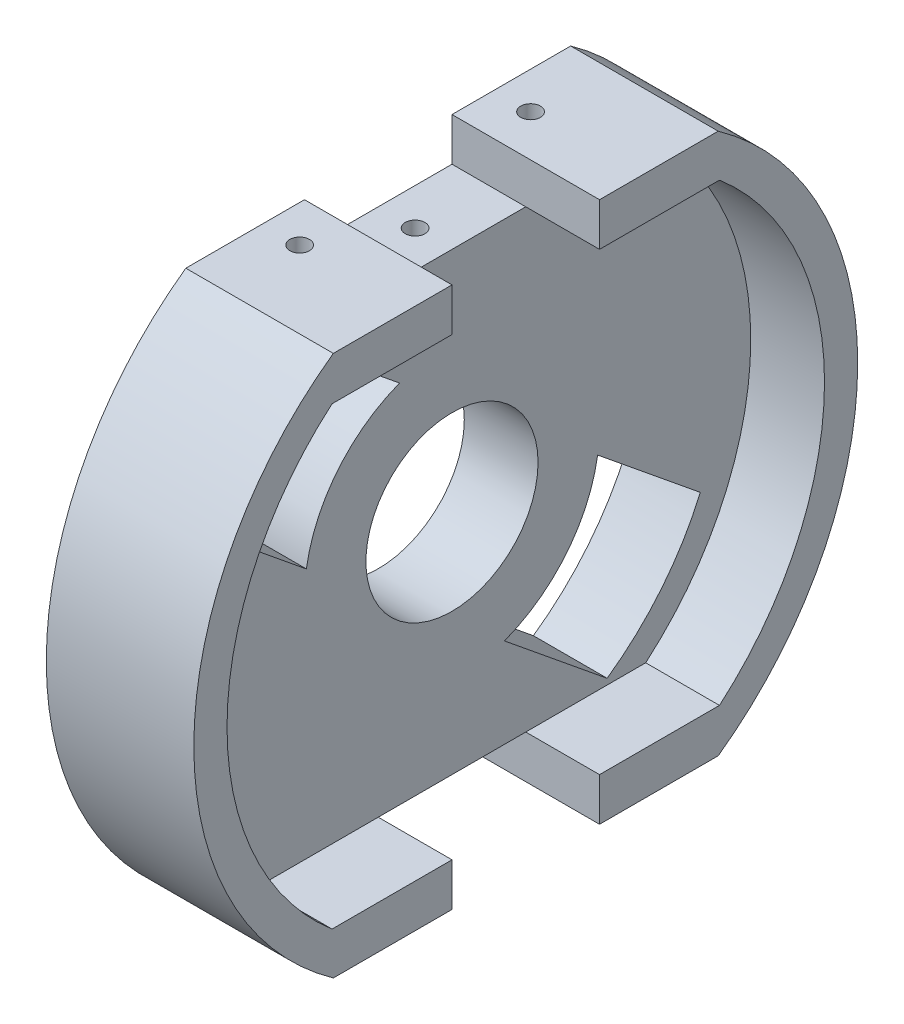
ISO-10303-21;
HEADER;
FILE_DESCRIPTION(('STEP AP214'),'2;1');
FILE_NAME('part.step','',(''),(''),'','','');
FILE_SCHEMA(('AUTOMOTIVE_DESIGN { 1 0 10303 214 1 1 1 1 }'));
ENDSEC;
DATA;
#1=APPLICATION_CONTEXT('core data for automotive mechanical design processes');
#2=APPLICATION_PROTOCOL_DEFINITION('international standard','automotive_design',2000,#1);
#3=PRODUCT_CONTEXT('',#1,'mechanical');
#4=PRODUCT('Part','Part','',(#3));
#5=PRODUCT_RELATED_PRODUCT_CATEGORY('part','',(#4));
#6=PRODUCT_DEFINITION_FORMATION('','',#4);
#7=PRODUCT_DEFINITION_CONTEXT('part definition',#1,'design');
#8=PRODUCT_DEFINITION('design','',#6,#7);
#9=PRODUCT_DEFINITION_SHAPE('','',#8);
#10=(LENGTH_UNIT() NAMED_UNIT(*) SI_UNIT(.MILLI.,.METRE.));
#11=(NAMED_UNIT(*) PLANE_ANGLE_UNIT() SI_UNIT($,.RADIAN.));
#12=(NAMED_UNIT(*) SI_UNIT($,.STERADIAN.) SOLID_ANGLE_UNIT());
#13=UNCERTAINTY_MEASURE_WITH_UNIT(LENGTH_MEASURE(1.E-05),#10,'distance_accuracy_value','');
#14=(GEOMETRIC_REPRESENTATION_CONTEXT(3) GLOBAL_UNCERTAINTY_ASSIGNED_CONTEXT((#13)) GLOBAL_UNIT_ASSIGNED_CONTEXT((#10,
#11,#12)) REPRESENTATION_CONTEXT('',''));
#15=CARTESIAN_POINT('',(0.,0.,0.));
#16=DIRECTION('',(0.,0.,1.));
#17=DIRECTION('',(1.,0.,0.));
#18=AXIS2_PLACEMENT_3D('',#15,#16,#17);
#19=CARTESIAN_POINT('',(3.,-11.,0.));
#20=DIRECTION('',(0.,1.,0.));
#21=DIRECTION('',(0.,0.,1.));
#22=AXIS2_PLACEMENT_3D('',#19,#20,#21);
#23=PLANE('',#22);
#24=DIRECTION('',(0.,0.,-1.));
#25=VECTOR('',#24,1.);
#26=CARTESIAN_POINT('',(6.,-11.,0.));
#27=LINE('',#26,#25);
#28=CARTESIAN_POINT('',(6.,-11.,-3.));
#29=VERTEX_POINT('',#28);
#30=CARTESIAN_POINT('',(6.,-11.,-7.82623792124926));
#31=VERTEX_POINT('',#30);
#32=EDGE_CURVE('E306',#29,#31,#27,.T.);
#33=ORIENTED_EDGE('',*,*,#32,.F.);
#34=DIRECTION('',(1.,0.,0.));
#35=VECTOR('',#34,1.);
#36=CARTESIAN_POINT('',(6.,-11.,-3.));
#37=LINE('',#36,#35);
#38=CARTESIAN_POINT('',(0.,-11.,-3.));
#39=VERTEX_POINT('',#38);
#40=EDGE_CURVE('E247',#39,#29,#37,.T.);
#41=ORIENTED_EDGE('',*,*,#40,.F.);
#42=DIRECTION('',(0.,0.,-1.));
#43=VECTOR('',#42,1.);
#44=CARTESIAN_POINT('',(0.,-11.,0.));
#45=LINE('',#44,#43);
#46=CARTESIAN_POINT('',(0.,-11.,-7.82623792124926));
#47=VERTEX_POINT('',#46);
#48=EDGE_CURVE('E387',#39,#47,#45,.T.);
#49=ORIENTED_EDGE('',*,*,#48,.T.);
#50=DIRECTION('',(-1.,0.,0.));
#51=VECTOR('',#50,1.);
#52=CARTESIAN_POINT('',(3.,-11.,-7.82623792124926));
#53=LINE('',#52,#51);
#54=EDGE_CURVE('E404',#31,#47,#53,.T.);
#55=ORIENTED_EDGE('',*,*,#54,.F.);
#56=EDGE_LOOP('',(#33,#41,#49,#55));
#57=FACE_BOUND('',#56,.T.);
#58=ADVANCED_FACE('F41',(#57),#23,.F.);
#59=CARTESIAN_POINT('',(6.,-9.25,0.));
#60=DIRECTION('',(0.,1.,0.));
#61=DIRECTION('',(0.,0.,1.));
#62=AXIS2_PLACEMENT_3D('',#59,#60,#61);
#63=PLANE('',#62);
#64=DIRECTION('',(-1.,0.,0.));
#65=VECTOR('',#64,1.);
#66=CARTESIAN_POINT('',(6.,-9.25,-3.));
#67=LINE('',#66,#65);
#68=CARTESIAN_POINT('',(6.,-9.25,-3.));
#69=VERTEX_POINT('',#68);
#70=CARTESIAN_POINT('',(3.,-9.25,-3.));
#71=VERTEX_POINT('',#70);
#72=EDGE_CURVE('E226',#69,#71,#67,.T.);
#73=ORIENTED_EDGE('',*,*,#72,.F.);
#74=DIRECTION('',(0.,0.,-1.));
#75=VECTOR('',#74,1.);
#76=CARTESIAN_POINT('',(6.,-9.25,0.));
#77=LINE('',#76,#75);
#78=CARTESIAN_POINT('',(6.,-9.25,-7.87781695649246));
#79=VERTEX_POINT('',#78);
#80=EDGE_CURVE('E294',#69,#79,#77,.T.);
#81=ORIENTED_EDGE('',*,*,#80,.T.);
#82=DIRECTION('',(-1.,0.,0.));
#83=VECTOR('',#82,1.);
#84=CARTESIAN_POINT('',(6.,-9.25,-7.87781695649246));
#85=LINE('',#84,#83);
#86=CARTESIAN_POINT('',(3.,-9.25,-7.87781695649246));
#87=VERTEX_POINT('',#86);
#88=EDGE_CURVE('E339',#79,#87,#85,.T.);
#89=ORIENTED_EDGE('',*,*,#88,.T.);
#90=DIRECTION('',(0.,0.,-1.));
#91=VECTOR('',#90,1.);
#92=CARTESIAN_POINT('',(3.,-9.25,0.));
#93=LINE('',#92,#91);
#94=EDGE_CURVE('E323',#71,#87,#93,.T.);
#95=ORIENTED_EDGE('',*,*,#94,.F.);
#96=EDGE_LOOP('',(#73,#81,#89,#95));
#97=FACE_BOUND('',#96,.T.);
#98=ADVANCED_FACE('F449',(#97),#63,.T.);
#99=CARTESIAN_POINT('',(6.,0.,0.));
#100=DIRECTION('',(1.,0.,0.));
#101=DIRECTION('',(0.,0.,-1.));
#102=AXIS2_PLACEMENT_3D('',#99,#100,#101);
#103=PLANE('',#102);
#104=DIRECTION('',(0.,1.,0.));
#105=VECTOR('',#104,1.);
#106=CARTESIAN_POINT('',(6.,-19.4852813742386,-3.));
#107=LINE('',#106,#105);
#108=EDGE_CURVE('E253',#29,#69,#107,.T.);
#109=ORIENTED_EDGE('',*,*,#108,.F.);
#110=ORIENTED_EDGE('',*,*,#32,.T.);
#111=CARTESIAN_POINT('',(6.,0.,0.));
#112=DIRECTION('',(1.,0.,0.));
#113=DIRECTION('',(0.,0.,-1.));
#114=AXIS2_PLACEMENT_3D('',#111,#112,#113);
#115=CIRCLE('',#114,13.5);
#116=CARTESIAN_POINT('',(6.,11.,-7.82623792124927));
#117=VERTEX_POINT('',#116);
#118=EDGE_CURVE('E310',#31,#117,#115,.T.);
#119=ORIENTED_EDGE('',*,*,#118,.T.);
#120=DIRECTION('',(0.,0.,1.));
#121=VECTOR('',#120,1.);
#122=CARTESIAN_POINT('',(6.,11.,0.));
#123=LINE('',#122,#121);
#124=CARTESIAN_POINT('',(6.,11.,-3.));
#125=VERTEX_POINT('',#124);
#126=EDGE_CURVE('E314',#117,#125,#123,.T.);
#127=ORIENTED_EDGE('',*,*,#126,.T.);
#128=DIRECTION('',(0.,1.,0.));
#129=VECTOR('',#128,1.);
#130=CARTESIAN_POINT('',(6.,0.764718625761432,-3.));
#131=LINE('',#130,#129);
#132=CARTESIAN_POINT('',(6.,9.25,-3.));
#133=VERTEX_POINT('',#132);
#134=EDGE_CURVE('E279',#133,#125,#131,.T.);
#135=ORIENTED_EDGE('',*,*,#134,.F.);
#136=DIRECTION('',(0.,0.,-1.));
#137=VECTOR('',#136,1.);
#138=CARTESIAN_POINT('',(6.,9.25,0.));
#139=LINE('',#138,#137);
#140=CARTESIAN_POINT('',(6.,9.25,-7.87781695649245));
#141=VERTEX_POINT('',#140);
#142=EDGE_CURVE('E302',#133,#141,#139,.T.);
#143=ORIENTED_EDGE('',*,*,#142,.T.);
#144=CARTESIAN_POINT('',(6.,0.,0.));
#145=DIRECTION('',(1.,0.,0.));
#146=DIRECTION('',(0.,0.,-1.));
#147=AXIS2_PLACEMENT_3D('',#144,#145,#146);
#148=CIRCLE('',#147,12.15);
#149=EDGE_CURVE('E291',#79,#141,#148,.T.);
#150=ORIENTED_EDGE('',*,*,#149,.F.);
#151=ORIENTED_EDGE('',*,*,#80,.F.);
#152=EDGE_LOOP('',(#109,#110,#119,#127,#135,#143,#150,#151));
#153=FACE_BOUND('',#152,.T.);
#154=ADVANCED_FACE('F455',(#153),#103,.T.);
#155=CARTESIAN_POINT('',(3.,11.,0.));
#156=DIRECTION('',(0.,1.,0.));
#157=DIRECTION('',(0.,0.,1.));
#158=AXIS2_PLACEMENT_3D('',#155,#156,#157);
#159=PLANE('',#158);
#160=CARTESIAN_POINT('',(1.5,11.,-4.69574275274956));
#161=DIRECTION('',(0.,1.,0.));
#162=DIRECTION('',(0.,0.,1.));
#163=AXIS2_PLACEMENT_3D('',#160,#161,#162);
#164=CIRCLE('',#163,0.4);
#165=CARTESIAN_POINT('',(1.5,11.,-4.29574275274956));
#166=VERTEX_POINT('',#165);
#167=EDGE_CURVE('E1074',#166,#166,#164,.T.);
#168=ORIENTED_EDGE('',*,*,#167,.F.);
#169=EDGE_LOOP('',(#168));
#170=FACE_BOUND('',#169,.T.);
#171=DIRECTION('',(-1.,0.,0.));
#172=VECTOR('',#171,1.);
#173=CARTESIAN_POINT('',(0.,11.,-3.));
#174=LINE('',#173,#172);
#175=CARTESIAN_POINT('',(0.,11.,-3.));
#176=VERTEX_POINT('',#175);
#177=EDGE_CURVE('E273',#125,#176,#174,.T.);
#178=ORIENTED_EDGE('',*,*,#177,.F.);
#179=ORIENTED_EDGE('',*,*,#126,.F.);
#180=DIRECTION('',(-1.,0.,0.));
#181=VECTOR('',#180,1.);
#182=CARTESIAN_POINT('',(3.,11.,-7.82623792124927));
#183=LINE('',#182,#181);
#184=CARTESIAN_POINT('',(0.,11.,-7.82623792124927));
#185=VERTEX_POINT('',#184);
#186=EDGE_CURVE('E401',#117,#185,#183,.T.);
#187=ORIENTED_EDGE('',*,*,#186,.T.);
#188=DIRECTION('',(0.,0.,-1.));
#189=VECTOR('',#188,1.);
#190=CARTESIAN_POINT('',(0.,11.,0.));
#191=LINE('',#190,#189);
#192=EDGE_CURVE('E381',#176,#185,#191,.T.);
#193=ORIENTED_EDGE('',*,*,#192,.F.);
#194=EDGE_LOOP('',(#178,#179,#187,#193));
#195=FACE_BOUND('',#194,.T.);
#196=ADVANCED_FACE('F511',(#170,#195),#159,.T.);
#197=CARTESIAN_POINT('',(6.,9.25,0.));
#198=DIRECTION('',(0.,1.,0.));
#199=DIRECTION('',(0.,0.,1.));
#200=AXIS2_PLACEMENT_3D('',#197,#198,#199);
#201=PLANE('',#200);
#202=ORIENTED_EDGE('',*,*,#142,.F.);
#203=DIRECTION('',(1.,0.,0.));
#204=VECTOR('',#203,1.);
#205=CARTESIAN_POINT('',(0.,9.25,-3.));
#206=LINE('',#205,#204);
#207=CARTESIAN_POINT('',(3.,9.25,-3.));
#208=VERTEX_POINT('',#207);
#209=EDGE_CURVE('E268',#208,#133,#206,.T.);
#210=ORIENTED_EDGE('',*,*,#209,.F.);
#211=DIRECTION('',(0.,0.,-1.));
#212=VECTOR('',#211,1.);
#213=CARTESIAN_POINT('',(3.,9.25,0.));
#214=LINE('',#213,#212);
#215=CARTESIAN_POINT('',(3.,9.25,-7.87781695649245));
#216=VERTEX_POINT('',#215);
#217=EDGE_CURVE('E330',#208,#216,#214,.T.);
#218=ORIENTED_EDGE('',*,*,#217,.T.);
#219=DIRECTION('',(-1.,0.,0.));
#220=VECTOR('',#219,1.);
#221=CARTESIAN_POINT('',(6.,9.25,-7.87781695649245));
#222=LINE('',#221,#220);
#223=EDGE_CURVE('E320',#141,#216,#222,.T.);
#224=ORIENTED_EDGE('',*,*,#223,.F.);
#225=EDGE_LOOP('',(#202,#210,#218,#224));
#226=FACE_BOUND('',#225,.T.);
#227=ADVANCED_FACE('F501',(#226),#201,.F.);
#228=CARTESIAN_POINT('',(3.,0.,0.));
#229=DIRECTION('',(1.,0.,0.));
#230=DIRECTION('',(0.,0.,-1.));
#231=AXIS2_PLACEMENT_3D('',#228,#229,#230);
#232=PLANE('',#231);
#233=CARTESIAN_POINT('',(3.,0.,0.));
#234=DIRECTION('',(1.,0.,0.));
#235=DIRECTION('',(0.,0.,-1.));
#236=AXIS2_PLACEMENT_3D('',#233,#234,#235);
#237=CIRCLE('',#236,3.5);
#238=CARTESIAN_POINT('',(3.,0.,-3.5));
#239=VERTEX_POINT('',#238);
#240=EDGE_CURVE('E362',#239,#239,#237,.T.);
#241=ORIENTED_EDGE('',*,*,#240,.F.);
#242=EDGE_LOOP('',(#241));
#243=FACE_BOUND('',#242,.T.);
#244=CARTESIAN_POINT('',(3.,0.,0.));
#245=DIRECTION('',(1.,0.,0.));
#246=DIRECTION('',(0.,0.,-1.));
#247=AXIS2_PLACEMENT_3D('',#244,#245,#246);
#248=CIRCLE('',#247,6.);
#249=CARTESIAN_POINT('',(3.,-5.60797389209177,-2.13322029467589));
#250=VERTEX_POINT('',#249);
#251=CARTESIAN_POINT('',(3.,-0.956563978988034,-5.92325800164931));
#252=VERTEX_POINT('',#251);
#253=EDGE_CURVE('E355',#250,#252,#248,.T.);
#254=ORIENTED_EDGE('',*,*,#253,.T.);
#255=DIRECTION('',(0.,-0.631672951162236,-0.775234985517289));
#256=VECTOR('',#255,1.);
#257=CARTESIAN_POINT('',(3.,2.32570495655187,-1.89501885348671));
#258=LINE('',#257,#256);
#259=CARTESIAN_POINT('',(3.,-4.35929319825423,-10.0993347707487));
#260=VERTEX_POINT('',#259);
#261=EDGE_CURVE('E350',#252,#260,#258,.T.);
#262=ORIENTED_EDGE('',*,*,#261,.T.);
#263=CARTESIAN_POINT('',(3.,0.,0.));
#264=DIRECTION('',(1.,0.,0.));
#265=DIRECTION('',(0.,0.,-1.));
#266=AXIS2_PLACEMENT_3D('',#263,#264,#265);
#267=CIRCLE('',#266,11.);
#268=CARTESIAN_POINT('',(3.,-9.01070311135796,-6.30929706377531));
#269=VERTEX_POINT('',#268);
#270=EDGE_CURVE('E359',#269,#260,#267,.T.);
#271=ORIENTED_EDGE('',*,*,#270,.F.);
#272=DIRECTION('',(0.,-0.631672951162236,-0.775234985517289));
#273=VECTOR('',#272,1.);
#274=CARTESIAN_POINT('',(3.,-2.32570495655187,1.89501885348671));
#275=LINE('',#274,#273);
#276=EDGE_CURVE('E356',#250,#269,#275,.T.);
#277=ORIENTED_EDGE('',*,*,#276,.F.);
#278=EDGE_LOOP('',(#254,#262,#271,#277));
#279=FACE_BOUND('',#278,.T.);
#280=CARTESIAN_POINT('',(3.,0.,0.));
#281=DIRECTION('',(1.,0.,0.));
#282=DIRECTION('',(0.,0.,-1.));
#283=AXIS2_PLACEMENT_3D('',#280,#281,#282);
#284=CIRCLE('',#283,11.);
#285=CARTESIAN_POINT('',(3.,9.01070311135796,6.30929706377532));
#286=VERTEX_POINT('',#285);
#287=CARTESIAN_POINT('',(3.,4.35929319825423,10.0993347707487));
#288=VERTEX_POINT('',#287);
#289=EDGE_CURVE('E343',#286,#288,#284,.T.);
#290=ORIENTED_EDGE('',*,*,#289,.F.);
#291=CARTESIAN_POINT('',(3.,5.60797389209177,2.1332202946759));
#292=VERTEX_POINT('',#291);
#293=EDGE_CURVE('E346',#286,#292,#258,.T.);
#294=ORIENTED_EDGE('',*,*,#293,.T.);
#295=CARTESIAN_POINT('',(3.,0.,0.));
#296=DIRECTION('',(1.,0.,0.));
#297=DIRECTION('',(0.,0.,-1.));
#298=AXIS2_PLACEMENT_3D('',#295,#296,#297);
#299=CIRCLE('',#298,6.);
#300=CARTESIAN_POINT('',(3.,0.956563978988031,5.92325800164931));
#301=VERTEX_POINT('',#300);
#302=EDGE_CURVE('E349',#292,#301,#299,.T.);
#303=ORIENTED_EDGE('',*,*,#302,.T.);
#304=EDGE_CURVE('E352',#288,#301,#275,.T.);
#305=ORIENTED_EDGE('',*,*,#304,.F.);
#306=EDGE_LOOP('',(#290,#294,#303,#305));
#307=FACE_BOUND('',#306,.T.);
#308=CARTESIAN_POINT('',(3.,-9.25,7.87781695649246));
#309=VERTEX_POINT('',#308);
#310=CARTESIAN_POINT('',(3.,-9.25,3.));
#311=VERTEX_POINT('',#310);
#312=EDGE_CURVE('E324',#309,#311,#93,.T.);
#313=ORIENTED_EDGE('',*,*,#312,.T.);
#314=DIRECTION('',(0.,0.,1.));
#315=VECTOR('',#314,1.);
#316=CARTESIAN_POINT('',(3.,-9.25,0.));
#317=LINE('',#316,#315);
#318=EDGE_CURVE('E234',#71,#311,#317,.T.);
#319=ORIENTED_EDGE('',*,*,#318,.F.);
#320=ORIENTED_EDGE('',*,*,#94,.T.);
#321=CARTESIAN_POINT('',(3.,0.,0.));
#322=DIRECTION('',(1.,0.,0.));
#323=DIRECTION('',(0.,0.,-1.));
#324=AXIS2_PLACEMENT_3D('',#321,#322,#323);
#325=CIRCLE('',#324,12.15);
#326=EDGE_CURVE('E290',#87,#216,#325,.T.);
#327=ORIENTED_EDGE('',*,*,#326,.T.);
#328=ORIENTED_EDGE('',*,*,#217,.F.);
#329=DIRECTION('',(0.,0.,1.));
#330=VECTOR('',#329,1.);
#331=CARTESIAN_POINT('',(3.,9.25,0.));
#332=LINE('',#331,#330);
#333=CARTESIAN_POINT('',(3.,9.25,3.));
#334=VERTEX_POINT('',#333);
#335=EDGE_CURVE('E287',#208,#334,#332,.T.);
#336=ORIENTED_EDGE('',*,*,#335,.T.);
#337=CARTESIAN_POINT('',(3.,9.25,7.87781695649245));
#338=VERTEX_POINT('',#337);
#339=EDGE_CURVE('E295',#338,#334,#214,.T.);
#340=ORIENTED_EDGE('',*,*,#339,.F.);
#341=CARTESIAN_POINT('',(3.,0.,0.));
#342=DIRECTION('',(1.,0.,0.));
#343=DIRECTION('',(0.,0.,-1.));
#344=AXIS2_PLACEMENT_3D('',#341,#342,#343);
#345=CIRCLE('',#344,12.15);
#346=EDGE_CURVE('E327',#338,#309,#345,.T.);
#347=ORIENTED_EDGE('',*,*,#346,.T.);
#348=EDGE_LOOP('',(#313,#319,#320,#327,#328,#336,#340,#347));
#349=FACE_BOUND('',#348,.T.);
#350=ADVANCED_FACE('F489',(#243,#279,#307,#349),#232,.T.);
#351=CARTESIAN_POINT('',(3.,0.,0.));
#352=DIRECTION('',(-1.,0.,0.));
#353=DIRECTION('',(0.,0.,1.));
#354=AXIS2_PLACEMENT_3D('',#351,#352,#353);
#355=CYLINDRICAL_SURFACE('',#354,6.);
#356=CARTESIAN_POINT('',(0.,0.,0.));
#357=DIRECTION('',(1.,0.,0.));
#358=DIRECTION('',(0.,0.,-1.));
#359=AXIS2_PLACEMENT_3D('',#356,#357,#358);
#360=CIRCLE('',#359,6.);
#361=CARTESIAN_POINT('',(0.,-5.60797389209177,-2.13322029467589));
#362=VERTEX_POINT('',#361);
#363=CARTESIAN_POINT('',(0.,-0.956563978988034,-5.92325800164931));
#364=VERTEX_POINT('',#363);
#365=EDGE_CURVE('E390',#362,#364,#360,.T.);
#366=ORIENTED_EDGE('',*,*,#365,.T.);
#367=DIRECTION('',(-1.,0.,0.));
#368=VECTOR('',#367,1.);
#369=CARTESIAN_POINT('',(3.,-0.956563978988034,-5.92325800164931));
#370=LINE('',#369,#368);
#371=EDGE_CURVE('E11',#252,#364,#370,.T.);
#372=ORIENTED_EDGE('',*,*,#371,.F.);
#373=ORIENTED_EDGE('',*,*,#253,.F.);
#374=DIRECTION('',(-1.,0.,0.));
#375=VECTOR('',#374,1.);
#376=CARTESIAN_POINT('',(3.,-5.60797389209177,-2.13322029467589));
#377=LINE('',#376,#375);
#378=EDGE_CURVE('E398',#250,#362,#377,.T.);
#379=ORIENTED_EDGE('',*,*,#378,.T.);
#380=EDGE_LOOP('',(#366,#372,#373,#379));
#381=FACE_BOUND('',#380,.T.);
#382=ADVANCED_FACE('F544',(#381),#355,.T.);
#383=CARTESIAN_POINT('',(3.,2.32570495655187,-1.89501885348671));
#384=DIRECTION('',(0.,0.775234985517289,-0.631672951162236));
#385=DIRECTION('',(0.,0.631672951162236,0.775234985517289));
#386=AXIS2_PLACEMENT_3D('',#383,#384,#385);
#387=PLANE('',#386);
#388=DIRECTION('',(0.,-0.631672951162236,-0.775234985517289));
#389=VECTOR('',#388,1.);
#390=CARTESIAN_POINT('',(0.,2.32570495655187,-1.89501885348671));
#391=LINE('',#390,#389);
#392=CARTESIAN_POINT('',(0.,-4.35929319825423,-10.0993347707487));
#393=VERTEX_POINT('',#392);
#394=EDGE_CURVE('E371',#364,#393,#391,.T.);
#395=ORIENTED_EDGE('',*,*,#394,.T.);
#396=DIRECTION('',(-1.,0.,0.));
#397=VECTOR('',#396,1.);
#398=CARTESIAN_POINT('',(3.,-4.35929319825423,-10.0993347707487));
#399=LINE('',#398,#397);
#400=EDGE_CURVE('E50',#260,#393,#399,.T.);
#401=ORIENTED_EDGE('',*,*,#400,.F.);
#402=ORIENTED_EDGE('',*,*,#261,.F.);
#403=ORIENTED_EDGE('',*,*,#371,.T.);
#404=EDGE_LOOP('',(#395,#401,#402,#403));
#405=FACE_BOUND('',#404,.T.);
#406=ADVANCED_FACE('F446',(#405),#387,.F.);
#407=CARTESIAN_POINT('',(3.,0.,0.));
#408=DIRECTION('',(-1.,0.,0.));
#409=DIRECTION('',(0.,0.,1.));
#410=AXIS2_PLACEMENT_3D('',#407,#408,#409);
#411=CYLINDRICAL_SURFACE('',#410,11.);
#412=CARTESIAN_POINT('',(0.,0.,0.));
#413=DIRECTION('',(1.,0.,0.));
#414=DIRECTION('',(0.,0.,-1.));
#415=AXIS2_PLACEMENT_3D('',#412,#413,#414);
#416=CIRCLE('',#415,11.);
#417=CARTESIAN_POINT('',(0.,-9.01070311135796,-6.30929706377531));
#418=VERTEX_POINT('',#417);
#419=EDGE_CURVE('E393',#418,#393,#416,.T.);
#420=ORIENTED_EDGE('',*,*,#419,.F.);
#421=DIRECTION('',(-1.,0.,0.));
#422=VECTOR('',#421,1.);
#423=CARTESIAN_POINT('',(3.,-9.01070311135796,-6.30929706377531));
#424=LINE('',#423,#422);
#425=EDGE_CURVE('E400',#269,#418,#424,.T.);
#426=ORIENTED_EDGE('',*,*,#425,.F.);
#427=ORIENTED_EDGE('',*,*,#270,.T.);
#428=ORIENTED_EDGE('',*,*,#400,.T.);
#429=EDGE_LOOP('',(#420,#426,#427,#428));
#430=FACE_BOUND('',#429,.T.);
#431=ADVANCED_FACE('F551',(#430),#411,.F.);
#432=CARTESIAN_POINT('',(3.,0.,0.));
#433=DIRECTION('',(-1.,0.,0.));
#434=DIRECTION('',(0.,0.,1.));
#435=AXIS2_PLACEMENT_3D('',#432,#433,#434);
#436=CYLINDRICAL_SURFACE('',#435,13.5);
#437=CARTESIAN_POINT('',(0.,0.,0.));
#438=DIRECTION('',(1.,0.,0.));
#439=DIRECTION('',(0.,0.,-1.));
#440=AXIS2_PLACEMENT_3D('',#437,#438,#439);
#441=CIRCLE('',#440,13.5);
#442=EDGE_CURVE('E377',#47,#185,#441,.T.);
#443=ORIENTED_EDGE('',*,*,#442,.T.);
#444=ORIENTED_EDGE('',*,*,#186,.F.);
#445=ORIENTED_EDGE('',*,*,#118,.F.);
#446=ORIENTED_EDGE('',*,*,#54,.T.);
#447=EDGE_LOOP('',(#443,#444,#445,#446));
#448=FACE_BOUND('',#447,.T.);
#449=ADVANCED_FACE('F514',(#448),#436,.T.);
#450=CARTESIAN_POINT('',(1.5,11.,4.69574275274956));
#451=DIRECTION('',(0.,1.,0.));
#452=DIRECTION('',(0.,0.,1.));
#453=AXIS2_PLACEMENT_3D('',#450,#451,#452);
#454=CIRCLE('',#453,0.4);
#455=CARTESIAN_POINT('',(1.5,11.,5.09574275274956));
#456=VERTEX_POINT('',#455);
#457=EDGE_CURVE('E1070',#456,#456,#454,.T.);
#458=ORIENTED_EDGE('',*,*,#457,.F.);
#459=EDGE_LOOP('',(#458));
#460=FACE_BOUND('',#459,.T.);
#461=DIRECTION('',(1.,0.,0.));
#462=VECTOR('',#461,1.);
#463=CARTESIAN_POINT('',(0.,11.,3.));
#464=LINE('',#463,#462);
#465=CARTESIAN_POINT('',(0.,11.,3.));
#466=VERTEX_POINT('',#465);
#467=CARTESIAN_POINT('',(6.,11.,3.));
#468=VERTEX_POINT('',#467);
#469=EDGE_CURVE('E66',#466,#468,#464,.T.);
#470=ORIENTED_EDGE('',*,*,#469,.F.);
#471=CARTESIAN_POINT('',(0.,11.,7.82623792124927));
#472=VERTEX_POINT('',#471);
#473=EDGE_CURVE('E382',#472,#466,#191,.T.);
#474=ORIENTED_EDGE('',*,*,#473,.F.);
#475=DIRECTION('',(-1.,0.,0.));
#476=VECTOR('',#475,1.);
#477=CARTESIAN_POINT('',(3.,11.,7.82623792124927));
#478=LINE('',#477,#476);
#479=CARTESIAN_POINT('',(6.,11.,7.82623792124927));
#480=VERTEX_POINT('',#479);
#481=EDGE_CURVE('E410',#480,#472,#478,.T.);
#482=ORIENTED_EDGE('',*,*,#481,.F.);
#483=EDGE_CURVE('E313',#468,#480,#123,.T.);
#484=ORIENTED_EDGE('',*,*,#483,.F.);
#485=EDGE_LOOP('',(#470,#474,#482,#484));
#486=FACE_BOUND('',#485,.T.);
#487=ADVANCED_FACE('F475',(#460,#486),#159,.T.);
#488=CARTESIAN_POINT('',(3.,0.,0.));
#489=DIRECTION('',(-1.,0.,0.));
#490=DIRECTION('',(0.,0.,1.));
#491=AXIS2_PLACEMENT_3D('',#488,#489,#490);
#492=CYLINDRICAL_SURFACE('',#491,13.5);
#493=CARTESIAN_POINT('',(0.,0.,0.));
#494=DIRECTION('',(1.,0.,0.));
#495=DIRECTION('',(0.,0.,-1.));
#496=AXIS2_PLACEMENT_3D('',#493,#494,#495);
#497=CIRCLE('',#496,13.5);
#498=CARTESIAN_POINT('',(0.,-11.,7.82623792124926));
#499=VERTEX_POINT('',#498);
#500=EDGE_CURVE('E385',#472,#499,#497,.T.);
#501=ORIENTED_EDGE('',*,*,#500,.T.);
#502=DIRECTION('',(-1.,0.,0.));
#503=VECTOR('',#502,1.);
#504=CARTESIAN_POINT('',(3.,-11.,7.82623792124926));
#505=LINE('',#504,#503);
#506=CARTESIAN_POINT('',(6.,-11.,7.82623792124926));
#507=VERTEX_POINT('',#506);
#508=EDGE_CURVE('E407',#507,#499,#505,.T.);
#509=ORIENTED_EDGE('',*,*,#508,.F.);
#510=CARTESIAN_POINT('',(6.,0.,0.));
#511=DIRECTION('',(1.,0.,0.));
#512=DIRECTION('',(0.,0.,-1.));
#513=AXIS2_PLACEMENT_3D('',#510,#511,#512);
#514=CIRCLE('',#513,13.5);
#515=EDGE_CURVE('E317',#480,#507,#514,.T.);
#516=ORIENTED_EDGE('',*,*,#515,.F.);
#517=ORIENTED_EDGE('',*,*,#481,.T.);
#518=EDGE_LOOP('',(#501,#509,#516,#517));
#519=FACE_BOUND('',#518,.T.);
#520=ADVANCED_FACE('F602',(#519),#492,.T.);
#521=CARTESIAN_POINT('',(3.,0.,0.));
#522=DIRECTION('',(-1.,0.,0.));
#523=DIRECTION('',(0.,0.,1.));
#524=AXIS2_PLACEMENT_3D('',#521,#522,#523);
#525=CYLINDRICAL_SURFACE('',#524,11.);
#526=CARTESIAN_POINT('',(0.,0.,0.));
#527=DIRECTION('',(1.,0.,0.));
#528=DIRECTION('',(0.,0.,-1.));
#529=AXIS2_PLACEMENT_3D('',#526,#527,#528);
#530=CIRCLE('',#529,11.);
#531=CARTESIAN_POINT('',(0.,9.01070311135796,6.30929706377532));
#532=VERTEX_POINT('',#531);
#533=CARTESIAN_POINT('',(0.,4.35929319825423,10.0993347707487));
#534=VERTEX_POINT('',#533);
#535=EDGE_CURVE('E342',#532,#534,#530,.T.);
#536=ORIENTED_EDGE('',*,*,#535,.F.);
#537=DIRECTION('',(-1.,0.,0.));
#538=VECTOR('',#537,1.);
#539=CARTESIAN_POINT('',(3.,9.01070311135796,6.30929706377532));
#540=LINE('',#539,#538);
#541=EDGE_CURVE('E45',#286,#532,#540,.T.);
#542=ORIENTED_EDGE('',*,*,#541,.F.);
#543=ORIENTED_EDGE('',*,*,#289,.T.);
#544=DIRECTION('',(-1.,0.,0.));
#545=VECTOR('',#544,1.);
#546=CARTESIAN_POINT('',(3.,4.35929319825423,10.0993347707487));
#547=LINE('',#546,#545);
#548=EDGE_CURVE('E365',#288,#534,#547,.T.);
#549=ORIENTED_EDGE('',*,*,#548,.T.);
#550=EDGE_LOOP('',(#536,#542,#543,#549));
#551=FACE_BOUND('',#550,.T.);
#552=ADVANCED_FACE('F43',(#551),#525,.F.);
#553=CARTESIAN_POINT('',(0.,5.60797389209177,2.1332202946759));
#554=VERTEX_POINT('',#553);
#555=EDGE_CURVE('E368',#532,#554,#391,.T.);
#556=ORIENTED_EDGE('',*,*,#555,.T.);
#557=DIRECTION('',(-1.,0.,0.));
#558=VECTOR('',#557,1.);
#559=CARTESIAN_POINT('',(3.,5.60797389209177,2.1332202946759));
#560=LINE('',#559,#558);
#561=EDGE_CURVE('E416',#292,#554,#560,.T.);
#562=ORIENTED_EDGE('',*,*,#561,.F.);
#563=ORIENTED_EDGE('',*,*,#293,.F.);
#564=ORIENTED_EDGE('',*,*,#541,.T.);
#565=EDGE_LOOP('',(#556,#562,#563,#564));
#566=FACE_BOUND('',#565,.T.);
#567=ADVANCED_FACE('F425',(#566),#387,.F.);
#568=CARTESIAN_POINT('',(3.,0.,0.));
#569=DIRECTION('',(-1.,0.,0.));
#570=DIRECTION('',(0.,0.,1.));
#571=AXIS2_PLACEMENT_3D('',#568,#569,#570);
#572=CYLINDRICAL_SURFACE('',#571,6.);
#573=CARTESIAN_POINT('',(0.,0.,0.));
#574=DIRECTION('',(1.,0.,0.));
#575=DIRECTION('',(0.,0.,-1.));
#576=AXIS2_PLACEMENT_3D('',#573,#574,#575);
#577=CIRCLE('',#576,6.);
#578=CARTESIAN_POINT('',(0.,0.956563978988031,5.92325800164931));
#579=VERTEX_POINT('',#578);
#580=EDGE_CURVE('E370',#554,#579,#577,.T.);
#581=ORIENTED_EDGE('',*,*,#580,.T.);
#582=DIRECTION('',(-1.,0.,0.));
#583=VECTOR('',#582,1.);
#584=CARTESIAN_POINT('',(3.,0.956563978988031,5.92325800164931));
#585=LINE('',#584,#583);
#586=EDGE_CURVE('E415',#301,#579,#585,.T.);
#587=ORIENTED_EDGE('',*,*,#586,.F.);
#588=ORIENTED_EDGE('',*,*,#302,.F.);
#589=ORIENTED_EDGE('',*,*,#561,.T.);
#590=EDGE_LOOP('',(#581,#587,#588,#589));
#591=FACE_BOUND('',#590,.T.);
#592=ADVANCED_FACE('F435',(#591),#572,.T.);
#593=CARTESIAN_POINT('',(3.,-2.32570495655187,1.89501885348671));
#594=DIRECTION('',(0.,0.775234985517289,-0.631672951162236));
#595=DIRECTION('',(0.,0.631672951162236,0.775234985517289));
#596=AXIS2_PLACEMENT_3D('',#593,#594,#595);
#597=PLANE('',#596);
#598=DIRECTION('',(0.,-0.631672951162236,-0.775234985517289));
#599=VECTOR('',#598,1.);
#600=CARTESIAN_POINT('',(0.,-2.32570495655187,1.89501885348671));
#601=LINE('',#600,#599);
#602=EDGE_CURVE('E378',#362,#418,#601,.T.);
#603=ORIENTED_EDGE('',*,*,#602,.F.);
#604=ORIENTED_EDGE('',*,*,#378,.F.);
#605=ORIENTED_EDGE('',*,*,#276,.T.);
#606=ORIENTED_EDGE('',*,*,#425,.T.);
#607=EDGE_LOOP('',(#603,#604,#605,#606));
#608=FACE_BOUND('',#607,.T.);
#609=ADVANCED_FACE('F437',(#608),#597,.T.);
#610=CARTESIAN_POINT('',(0.,-11.,3.));
#611=VERTEX_POINT('',#610);
#612=EDGE_CURVE('E388',#499,#611,#45,.T.);
#613=ORIENTED_EDGE('',*,*,#612,.T.);
#614=DIRECTION('',(-1.,0.,0.));
#615=VECTOR('',#614,1.);
#616=CARTESIAN_POINT('',(6.,-11.,3.));
#617=LINE('',#616,#615);
#618=CARTESIAN_POINT('',(6.,-11.,3.));
#619=VERTEX_POINT('',#618);
#620=EDGE_CURVE('E220',#619,#611,#617,.T.);
#621=ORIENTED_EDGE('',*,*,#620,.F.);
#622=EDGE_CURVE('E307',#507,#619,#27,.T.);
#623=ORIENTED_EDGE('',*,*,#622,.F.);
#624=ORIENTED_EDGE('',*,*,#508,.T.);
#625=EDGE_LOOP('',(#613,#621,#623,#624));
#626=FACE_BOUND('',#625,.T.);
#627=ADVANCED_FACE('F442',(#626),#23,.F.);
#628=EDGE_CURVE('E374',#534,#579,#601,.T.);
#629=ORIENTED_EDGE('',*,*,#628,.F.);
#630=ORIENTED_EDGE('',*,*,#548,.F.);
#631=ORIENTED_EDGE('',*,*,#304,.T.);
#632=ORIENTED_EDGE('',*,*,#586,.T.);
#633=EDGE_LOOP('',(#629,#630,#631,#632));
#634=FACE_BOUND('',#633,.T.);
#635=ADVANCED_FACE('F433',(#634),#597,.T.);
#636=CARTESIAN_POINT('',(3.,0.,0.));
#637=DIRECTION('',(-1.,0.,0.));
#638=DIRECTION('',(0.,0.,1.));
#639=AXIS2_PLACEMENT_3D('',#636,#637,#638);
#640=CYLINDRICAL_SURFACE('',#639,3.5);
#641=ORIENTED_EDGE('',*,*,#240,.T.);
#642=EDGE_LOOP('',(#641));
#643=FACE_BOUND('',#642,.T.);
#644=CARTESIAN_POINT('',(0.,0.,0.));
#645=DIRECTION('',(1.,0.,0.));
#646=DIRECTION('',(0.,0.,-1.));
#647=AXIS2_PLACEMENT_3D('',#644,#645,#646);
#648=CIRCLE('',#647,3.5);
#649=CARTESIAN_POINT('',(0.,0.,-3.5));
#650=VERTEX_POINT('',#649);
#651=EDGE_CURVE('E347',#650,#650,#648,.T.);
#652=ORIENTED_EDGE('',*,*,#651,.F.);
#653=EDGE_LOOP('',(#652));
#654=FACE_BOUND('',#653,.T.);
#655=ADVANCED_FACE('F467',(#643,#654),#640,.F.);
#656=CARTESIAN_POINT('',(0.,0.,0.));
#657=DIRECTION('',(1.,0.,0.));
#658=DIRECTION('',(0.,0.,-1.));
#659=AXIS2_PLACEMENT_3D('',#656,#657,#658);
#660=PLANE('',#659);
#661=ORIENTED_EDGE('',*,*,#48,.F.);
#662=DIRECTION('',(0.,1.,0.));
#663=VECTOR('',#662,1.);
#664=CARTESIAN_POINT('',(0.,-19.4852813742386,-3.));
#665=LINE('',#664,#663);
#666=CARTESIAN_POINT('',(0.,-9.25,-3.));
#667=VERTEX_POINT('',#666);
#668=EDGE_CURVE('E240',#39,#667,#665,.T.);
#669=ORIENTED_EDGE('',*,*,#668,.T.);
#670=DIRECTION('',(0.,0.,1.));
#671=VECTOR('',#670,1.);
#672=CARTESIAN_POINT('',(0.,-9.25,0.));
#673=LINE('',#672,#671);
#674=CARTESIAN_POINT('',(0.,-9.25,3.));
#675=VERTEX_POINT('',#674);
#676=EDGE_CURVE('E231',#667,#675,#673,.T.);
#677=ORIENTED_EDGE('',*,*,#676,.T.);
#678=DIRECTION('',(0.,1.,0.));
#679=VECTOR('',#678,1.);
#680=CARTESIAN_POINT('',(0.,-19.4852813742386,3.));
#681=LINE('',#680,#679);
#682=EDGE_CURVE('E215',#611,#675,#681,.T.);
#683=ORIENTED_EDGE('',*,*,#682,.F.);
#684=ORIENTED_EDGE('',*,*,#612,.F.);
#685=ORIENTED_EDGE('',*,*,#500,.F.);
#686=ORIENTED_EDGE('',*,*,#473,.T.);
#687=DIRECTION('',(0.,1.,0.));
#688=VECTOR('',#687,1.);
#689=CARTESIAN_POINT('',(0.,0.764718625761432,3.));
#690=LINE('',#689,#688);
#691=CARTESIAN_POINT('',(0.,9.25,3.));
#692=VERTEX_POINT('',#691);
#693=EDGE_CURVE('E275',#692,#466,#690,.T.);
#694=ORIENTED_EDGE('',*,*,#693,.F.);
#695=DIRECTION('',(0.,0.,-1.));
#696=VECTOR('',#695,1.);
#697=CARTESIAN_POINT('',(0.,9.25,-3.));
#698=LINE('',#697,#696);
#699=CARTESIAN_POINT('',(0.,9.25,-3.));
#700=VERTEX_POINT('',#699);
#701=EDGE_CURVE('E267',#692,#700,#698,.T.);
#702=ORIENTED_EDGE('',*,*,#701,.T.);
#703=DIRECTION('',(0.,1.,0.));
#704=VECTOR('',#703,1.);
#705=CARTESIAN_POINT('',(0.,0.764718625761432,-3.));
#706=LINE('',#705,#704);
#707=EDGE_CURVE('E276',#700,#176,#706,.T.);
#708=ORIENTED_EDGE('',*,*,#707,.T.);
#709=ORIENTED_EDGE('',*,*,#192,.T.);
#710=ORIENTED_EDGE('',*,*,#442,.F.);
#711=EDGE_LOOP('',(#661,#669,#677,#683,#684,#685,#686,#694,#702,#708,#709,#710));
#712=FACE_BOUND('',#711,.T.);
#713=ORIENTED_EDGE('',*,*,#535,.T.);
#714=ORIENTED_EDGE('',*,*,#628,.T.);
#715=ORIENTED_EDGE('',*,*,#580,.F.);
#716=ORIENTED_EDGE('',*,*,#555,.F.);
#717=EDGE_LOOP('',(#713,#714,#715,#716));
#718=FACE_BOUND('',#717,.T.);
#719=ORIENTED_EDGE('',*,*,#365,.F.);
#720=ORIENTED_EDGE('',*,*,#602,.T.);
#721=ORIENTED_EDGE('',*,*,#419,.T.);
#722=ORIENTED_EDGE('',*,*,#394,.F.);
#723=EDGE_LOOP('',(#719,#720,#721,#722));
#724=FACE_BOUND('',#723,.T.);
#725=ORIENTED_EDGE('',*,*,#651,.T.);
#726=EDGE_LOOP('',(#725));
#727=FACE_BOUND('',#726,.T.);
#728=ADVANCED_FACE('F238',(#712,#718,#724,#727),#660,.F.);
#729=CARTESIAN_POINT('',(6.,0.,0.));
#730=DIRECTION('',(-1.,0.,0.));
#731=DIRECTION('',(0.,0.,1.));
#732=AXIS2_PLACEMENT_3D('',#729,#730,#731);
#733=CYLINDRICAL_SURFACE('',#732,12.15);
#734=ORIENTED_EDGE('',*,*,#326,.F.);
#735=ORIENTED_EDGE('',*,*,#88,.F.);
#736=ORIENTED_EDGE('',*,*,#149,.T.);
#737=ORIENTED_EDGE('',*,*,#223,.T.);
#738=EDGE_LOOP('',(#734,#735,#736,#737));
#739=FACE_BOUND('',#738,.T.);
#740=ADVANCED_FACE('F525',(#739),#733,.F.);
#741=DIRECTION('',(1.,0.,0.));
#742=VECTOR('',#741,1.);
#743=CARTESIAN_POINT('',(6.,-9.25,3.));
#744=LINE('',#743,#742);
#745=CARTESIAN_POINT('',(6.,-9.25,3.));
#746=VERTEX_POINT('',#745);
#747=EDGE_CURVE('E58',#311,#746,#744,.T.);
#748=ORIENTED_EDGE('',*,*,#747,.F.);
#749=ORIENTED_EDGE('',*,*,#312,.F.);
#750=DIRECTION('',(-1.,0.,0.));
#751=VECTOR('',#750,1.);
#752=CARTESIAN_POINT('',(6.,-9.25,7.87781695649246));
#753=LINE('',#752,#751);
#754=CARTESIAN_POINT('',(6.,-9.25,7.87781695649246));
#755=VERTEX_POINT('',#754);
#756=EDGE_CURVE('E337',#755,#309,#753,.T.);
#757=ORIENTED_EDGE('',*,*,#756,.F.);
#758=EDGE_CURVE('E296',#755,#746,#77,.T.);
#759=ORIENTED_EDGE('',*,*,#758,.T.);
#760=EDGE_LOOP('',(#748,#749,#757,#759));
#761=FACE_BOUND('',#760,.T.);
#762=ADVANCED_FACE('F458',(#761),#63,.T.);
#763=CARTESIAN_POINT('',(6.,0.,0.));
#764=DIRECTION('',(-1.,0.,0.));
#765=DIRECTION('',(0.,0.,1.));
#766=AXIS2_PLACEMENT_3D('',#763,#764,#765);
#767=CYLINDRICAL_SURFACE('',#766,12.15);
#768=ORIENTED_EDGE('',*,*,#346,.F.);
#769=DIRECTION('',(-1.,0.,0.));
#770=VECTOR('',#769,1.);
#771=CARTESIAN_POINT('',(6.,9.25,7.87781695649245));
#772=LINE('',#771,#770);
#773=CARTESIAN_POINT('',(6.,9.25,7.87781695649245));
#774=VERTEX_POINT('',#773);
#775=EDGE_CURVE('E335',#774,#338,#772,.T.);
#776=ORIENTED_EDGE('',*,*,#775,.F.);
#777=CARTESIAN_POINT('',(6.,0.,0.));
#778=DIRECTION('',(1.,0.,0.));
#779=DIRECTION('',(0.,0.,-1.));
#780=AXIS2_PLACEMENT_3D('',#777,#778,#779);
#781=CIRCLE('',#780,12.15);
#782=EDGE_CURVE('E299',#774,#755,#781,.T.);
#783=ORIENTED_EDGE('',*,*,#782,.T.);
#784=ORIENTED_EDGE('',*,*,#756,.T.);
#785=EDGE_LOOP('',(#768,#776,#783,#784));
#786=FACE_BOUND('',#785,.T.);
#787=ADVANCED_FACE('F530',(#786),#767,.F.);
#788=ORIENTED_EDGE('',*,*,#339,.T.);
#789=DIRECTION('',(-1.,0.,0.));
#790=VECTOR('',#789,1.);
#791=CARTESIAN_POINT('',(0.,9.25,3.));
#792=LINE('',#791,#790);
#793=CARTESIAN_POINT('',(6.,9.25,3.));
#794=VERTEX_POINT('',#793);
#795=EDGE_CURVE('E284',#794,#334,#792,.T.);
#796=ORIENTED_EDGE('',*,*,#795,.F.);
#797=EDGE_CURVE('E303',#774,#794,#139,.T.);
#798=ORIENTED_EDGE('',*,*,#797,.F.);
#799=ORIENTED_EDGE('',*,*,#775,.T.);
#800=EDGE_LOOP('',(#788,#796,#798,#799));
#801=FACE_BOUND('',#800,.T.);
#802=ADVANCED_FACE('F485',(#801),#201,.F.);
#803=DIRECTION('',(0.,1.,0.));
#804=VECTOR('',#803,1.);
#805=CARTESIAN_POINT('',(6.,-19.4852813742386,3.));
#806=LINE('',#805,#804);
#807=EDGE_CURVE('E225',#619,#746,#806,.T.);
#808=ORIENTED_EDGE('',*,*,#807,.T.);
#809=ORIENTED_EDGE('',*,*,#758,.F.);
#810=ORIENTED_EDGE('',*,*,#782,.F.);
#811=ORIENTED_EDGE('',*,*,#797,.T.);
#812=DIRECTION('',(0.,1.,0.));
#813=VECTOR('',#812,1.);
#814=CARTESIAN_POINT('',(6.,0.764718625761432,3.));
#815=LINE('',#814,#813);
#816=EDGE_CURVE('E281',#794,#468,#815,.T.);
#817=ORIENTED_EDGE('',*,*,#816,.T.);
#818=ORIENTED_EDGE('',*,*,#483,.T.);
#819=ORIENTED_EDGE('',*,*,#515,.T.);
#820=ORIENTED_EDGE('',*,*,#622,.T.);
#821=EDGE_LOOP('',(#808,#809,#810,#811,#817,#818,#819,#820));
#822=FACE_BOUND('',#821,.T.);
#823=ADVANCED_FACE('F479',(#822),#103,.T.);
#824=CARTESIAN_POINT('',(0.,0.764718625761432,-3.));
#825=DIRECTION('',(0.,0.,-1.));
#826=DIRECTION('',(-1.,0.,0.));
#827=AXIS2_PLACEMENT_3D('',#824,#825,#826);
#828=PLANE('',#827);
#829=EDGE_CURVE('E264',#700,#208,#206,.T.);
#830=ORIENTED_EDGE('',*,*,#829,.T.);
#831=ORIENTED_EDGE('',*,*,#209,.T.);
#832=ORIENTED_EDGE('',*,*,#134,.T.);
#833=ORIENTED_EDGE('',*,*,#177,.T.);
#834=ORIENTED_EDGE('',*,*,#707,.F.);
#835=EDGE_LOOP('',(#830,#831,#832,#833,#834));
#836=FACE_BOUND('',#835,.T.);
#837=ADVANCED_FACE('F497',(#836),#828,.F.);
#838=CARTESIAN_POINT('',(0.,0.764718625761432,3.));
#839=DIRECTION('',(0.,0.,1.));
#840=DIRECTION('',(1.,0.,0.));
#841=AXIS2_PLACEMENT_3D('',#838,#839,#840);
#842=PLANE('',#841);
#843=ORIENTED_EDGE('',*,*,#795,.T.);
#844=EDGE_CURVE('E271',#334,#692,#792,.T.);
#845=ORIENTED_EDGE('',*,*,#844,.T.);
#846=ORIENTED_EDGE('',*,*,#693,.T.);
#847=ORIENTED_EDGE('',*,*,#469,.T.);
#848=ORIENTED_EDGE('',*,*,#816,.F.);
#849=EDGE_LOOP('',(#843,#845,#846,#847,#848));
#850=FACE_BOUND('',#849,.T.);
#851=ADVANCED_FACE('F483',(#850),#842,.F.);
#852=CARTESIAN_POINT('',(6.,9.25,0.));
#853=DIRECTION('',(0.,1.,0.));
#854=DIRECTION('',(0.,0.,1.));
#855=AXIS2_PLACEMENT_3D('',#852,#853,#854);
#856=PLANE('',#855);
#857=CARTESIAN_POINT('',(1.5,9.25,0.));
#858=DIRECTION('',(0.,1.,0.));
#859=DIRECTION('',(0.,0.,1.));
#860=AXIS2_PLACEMENT_3D('',#857,#858,#859);
#861=CIRCLE('',#860,0.4);
#862=CARTESIAN_POINT('',(1.5,9.25,0.4));
#863=VERTEX_POINT('',#862);
#864=EDGE_CURVE('E258',#863,#863,#861,.T.);
#865=ORIENTED_EDGE('',*,*,#864,.F.);
#866=EDGE_LOOP('',(#865));
#867=FACE_BOUND('',#866,.T.);
#868=ORIENTED_EDGE('',*,*,#829,.F.);
#869=ORIENTED_EDGE('',*,*,#701,.F.);
#870=ORIENTED_EDGE('',*,*,#844,.F.);
#871=ORIENTED_EDGE('',*,*,#335,.F.);
#872=EDGE_LOOP('',(#868,#869,#870,#871));
#873=FACE_BOUND('',#872,.T.);
#874=ADVANCED_FACE('F492',(#867,#873),#856,.T.);
#875=CARTESIAN_POINT('',(1.5,6.25,0.));
#876=DIRECTION('',(0.,1.,0.));
#877=DIRECTION('',(0.,0.,1.));
#878=AXIS2_PLACEMENT_3D('',#875,#876,#877);
#879=CYLINDRICAL_SURFACE('',#878,0.4);
#880=CARTESIAN_POINT('',(1.5,6.25,0.));
#881=DIRECTION('',(0.,1.,0.));
#882=DIRECTION('',(0.,0.,1.));
#883=AXIS2_PLACEMENT_3D('',#880,#881,#882);
#884=CIRCLE('',#883,0.4);
#885=CARTESIAN_POINT('',(1.5,6.25,0.4));
#886=VERTEX_POINT('',#885);
#887=EDGE_CURVE('E259',#886,#886,#884,.T.);
#888=ORIENTED_EDGE('',*,*,#887,.F.);
#889=EDGE_LOOP('',(#888));
#890=FACE_BOUND('',#889,.T.);
#891=ORIENTED_EDGE('',*,*,#864,.T.);
#892=EDGE_LOOP('',(#891));
#893=FACE_BOUND('',#892,.T.);
#894=ADVANCED_FACE('F782',(#890,#893),#879,.F.);
#895=CARTESIAN_POINT('',(1.5,6.25,0.));
#896=DIRECTION('',(0.,1.,0.));
#897=DIRECTION('',(0.,0.,1.));
#898=AXIS2_PLACEMENT_3D('',#895,#896,#897);
#899=PLANE('',#898);
#900=ORIENTED_EDGE('',*,*,#887,.T.);
#901=EDGE_LOOP('',(#900));
#902=FACE_BOUND('',#901,.T.);
#903=ADVANCED_FACE('F684',(#902),#899,.T.);
#904=CARTESIAN_POINT('',(6.,-19.4852813742386,-3.));
#905=DIRECTION('',(0.,0.,-1.));
#906=DIRECTION('',(-1.,0.,0.));
#907=AXIS2_PLACEMENT_3D('',#904,#905,#906);
#908=PLANE('',#907);
#909=ORIENTED_EDGE('',*,*,#40,.T.);
#910=ORIENTED_EDGE('',*,*,#108,.T.);
#911=ORIENTED_EDGE('',*,*,#72,.T.);
#912=EDGE_CURVE('E235',#71,#667,#67,.T.);
#913=ORIENTED_EDGE('',*,*,#912,.T.);
#914=ORIENTED_EDGE('',*,*,#668,.F.);
#915=EDGE_LOOP('',(#909,#910,#911,#913,#914));
#916=FACE_BOUND('',#915,.T.);
#917=ADVANCED_FACE('F519',(#916),#908,.F.);
#918=CARTESIAN_POINT('',(6.,-19.4852813742386,3.));
#919=DIRECTION('',(0.,0.,1.));
#920=DIRECTION('',(1.,0.,0.));
#921=AXIS2_PLACEMENT_3D('',#918,#919,#920);
#922=PLANE('',#921);
#923=ORIENTED_EDGE('',*,*,#620,.T.);
#924=ORIENTED_EDGE('',*,*,#682,.T.);
#925=EDGE_CURVE('E218',#675,#311,#744,.T.);
#926=ORIENTED_EDGE('',*,*,#925,.T.);
#927=ORIENTED_EDGE('',*,*,#747,.T.);
#928=ORIENTED_EDGE('',*,*,#807,.F.);
#929=EDGE_LOOP('',(#923,#924,#926,#927,#928));
#930=FACE_BOUND('',#929,.T.);
#931=ADVANCED_FACE('F217',(#930),#922,.F.);
#932=CARTESIAN_POINT('',(0.,-9.25,0.));
#933=DIRECTION('',(0.,1.,0.));
#934=DIRECTION('',(0.,0.,1.));
#935=AXIS2_PLACEMENT_3D('',#932,#933,#934);
#936=PLANE('',#935);
#937=CARTESIAN_POINT('',(1.5,-9.25,0.));
#938=DIRECTION('',(0.,1.,0.));
#939=DIRECTION('',(0.,0.,1.));
#940=AXIS2_PLACEMENT_3D('',#937,#938,#939);
#941=CIRCLE('',#940,0.4);
#942=CARTESIAN_POINT('',(1.5,-9.25,0.399999999999997));
#943=VERTEX_POINT('',#942);
#944=EDGE_CURVE('E244',#943,#943,#941,.T.);
#945=ORIENTED_EDGE('',*,*,#944,.T.);
#946=EDGE_LOOP('',(#945));
#947=FACE_BOUND('',#946,.T.);
#948=ORIENTED_EDGE('',*,*,#318,.T.);
#949=ORIENTED_EDGE('',*,*,#925,.F.);
#950=ORIENTED_EDGE('',*,*,#676,.F.);
#951=ORIENTED_EDGE('',*,*,#912,.F.);
#952=EDGE_LOOP('',(#948,#949,#950,#951));
#953=FACE_BOUND('',#952,.T.);
#954=ADVANCED_FACE('F230',(#947,#953),#936,.F.);
#955=CARTESIAN_POINT('',(1.5,-6.25,0.));
#956=DIRECTION('',(0.,-1.,0.));
#957=DIRECTION('',(0.,0.,-1.));
#958=AXIS2_PLACEMENT_3D('',#955,#956,#957);
#959=CYLINDRICAL_SURFACE('',#958,0.4);
#960=CARTESIAN_POINT('',(1.5,-6.25,0.));
#961=DIRECTION('',(0.,1.,0.));
#962=DIRECTION('',(0.,0.,1.));
#963=AXIS2_PLACEMENT_3D('',#960,#961,#962);
#964=CIRCLE('',#963,0.4);
#965=CARTESIAN_POINT('',(1.5,-6.25,0.399999999999998));
#966=VERTEX_POINT('',#965);
#967=EDGE_CURVE('E241',#966,#966,#964,.T.);
#968=ORIENTED_EDGE('',*,*,#967,.T.);
#969=EDGE_LOOP('',(#968));
#970=FACE_BOUND('',#969,.T.);
#971=ORIENTED_EDGE('',*,*,#944,.F.);
#972=EDGE_LOOP('',(#971));
#973=FACE_BOUND('',#972,.T.);
#974=ADVANCED_FACE('F705',(#970,#973),#959,.F.);
#975=CARTESIAN_POINT('',(1.5,-6.25,0.));
#976=DIRECTION('',(0.,1.,0.));
#977=DIRECTION('',(0.,0.,1.));
#978=AXIS2_PLACEMENT_3D('',#975,#976,#977);
#979=PLANE('',#978);
#980=ORIENTED_EDGE('',*,*,#967,.F.);
#981=EDGE_LOOP('',(#980));
#982=FACE_BOUND('',#981,.T.);
#983=ADVANCED_FACE('F716',(#982),#979,.F.);
#984=CARTESIAN_POINT('',(1.5,9.,4.69574275274956));
#985=DIRECTION('',(0.,1.,0.));
#986=DIRECTION('',(0.,0.,1.));
#987=AXIS2_PLACEMENT_3D('',#984,#985,#986);
#988=CYLINDRICAL_SURFACE('',#987,0.4);
#989=CARTESIAN_POINT('',(1.5,9.,4.69574275274956));
#990=DIRECTION('',(0.,1.,0.));
#991=DIRECTION('',(0.,0.,1.));
#992=AXIS2_PLACEMENT_3D('',#989,#990,#991);
#993=CIRCLE('',#992,0.4);
#994=CARTESIAN_POINT('',(1.5,9.,5.09574275274956));
#995=VERTEX_POINT('',#994);
#996=EDGE_CURVE('E1069',#995,#995,#993,.T.);
#997=ORIENTED_EDGE('',*,*,#996,.F.);
#998=EDGE_LOOP('',(#997));
#999=FACE_BOUND('',#998,.T.);
#1000=ORIENTED_EDGE('',*,*,#457,.T.);
#1001=EDGE_LOOP('',(#1000));
#1002=FACE_BOUND('',#1001,.T.);
#1003=ADVANCED_FACE('F726',(#999,#1002),#988,.F.);
#1004=CARTESIAN_POINT('',(1.5,9.,4.69574275274956));
#1005=DIRECTION('',(0.,1.,0.));
#1006=DIRECTION('',(0.,0.,1.));
#1007=AXIS2_PLACEMENT_3D('',#1004,#1005,#1006);
#1008=PLANE('',#1007);
#1009=ORIENTED_EDGE('',*,*,#996,.T.);
#1010=EDGE_LOOP('',(#1009));
#1011=FACE_BOUND('',#1010,.T.);
#1012=ADVANCED_FACE('F1059',(#1011),#1008,.T.);
#1013=CARTESIAN_POINT('',(1.5,9.,-4.69574275274956));
#1014=DIRECTION('',(0.,1.,0.));
#1015=DIRECTION('',(0.,0.,1.));
#1016=AXIS2_PLACEMENT_3D('',#1013,#1014,#1015);
#1017=CYLINDRICAL_SURFACE('',#1016,0.4);
#1018=CARTESIAN_POINT('',(1.5,9.,-4.69574275274956));
#1019=DIRECTION('',(0.,1.,0.));
#1020=DIRECTION('',(0.,0.,1.));
#1021=AXIS2_PLACEMENT_3D('',#1018,#1019,#1020);
#1022=CIRCLE('',#1021,0.4);
#1023=CARTESIAN_POINT('',(1.5,9.,-4.29574275274956));
#1024=VERTEX_POINT('',#1023);
#1025=EDGE_CURVE('E1079',#1024,#1024,#1022,.T.);
#1026=ORIENTED_EDGE('',*,*,#1025,.F.);
#1027=EDGE_LOOP('',(#1026));
#1028=FACE_BOUND('',#1027,.T.);
#1029=ORIENTED_EDGE('',*,*,#167,.T.);
#1030=EDGE_LOOP('',(#1029));
#1031=FACE_BOUND('',#1030,.T.);
#1032=ADVANCED_FACE('F1055',(#1028,#1031),#1017,.F.);
#1033=CARTESIAN_POINT('',(1.5,9.,-4.69574275274956));
#1034=DIRECTION('',(0.,1.,0.));
#1035=DIRECTION('',(0.,0.,1.));
#1036=AXIS2_PLACEMENT_3D('',#1033,#1034,#1035);
#1037=PLANE('',#1036);
#1038=ORIENTED_EDGE('',*,*,#1025,.T.);
#1039=EDGE_LOOP('',(#1038));
#1040=FACE_BOUND('',#1039,.T.);
#1041=ADVANCED_FACE('F1052',(#1040),#1037,.T.);
#1042=CLOSED_SHELL('',(#58,#98,#154,#196,#227,#350,#382,#406,#431,#449,#487,#520,#552,#567,#592,
#609,#627,#635,#655,#728,#740,#762,#787,#802,#823,#837,#851,#874,#894,#903,#917,#931,#954,#974,
#983,#1003,#1012,#1032,#1041));
#1043=MANIFOLD_SOLID_BREP('B2',#1042);
#1044=ADVANCED_BREP_SHAPE_REPRESENTATION('',(#18,#1043),#14);
#1045=SHAPE_DEFINITION_REPRESENTATION(#9,#1044);
ENDSEC;
END-ISO-10303-21;
